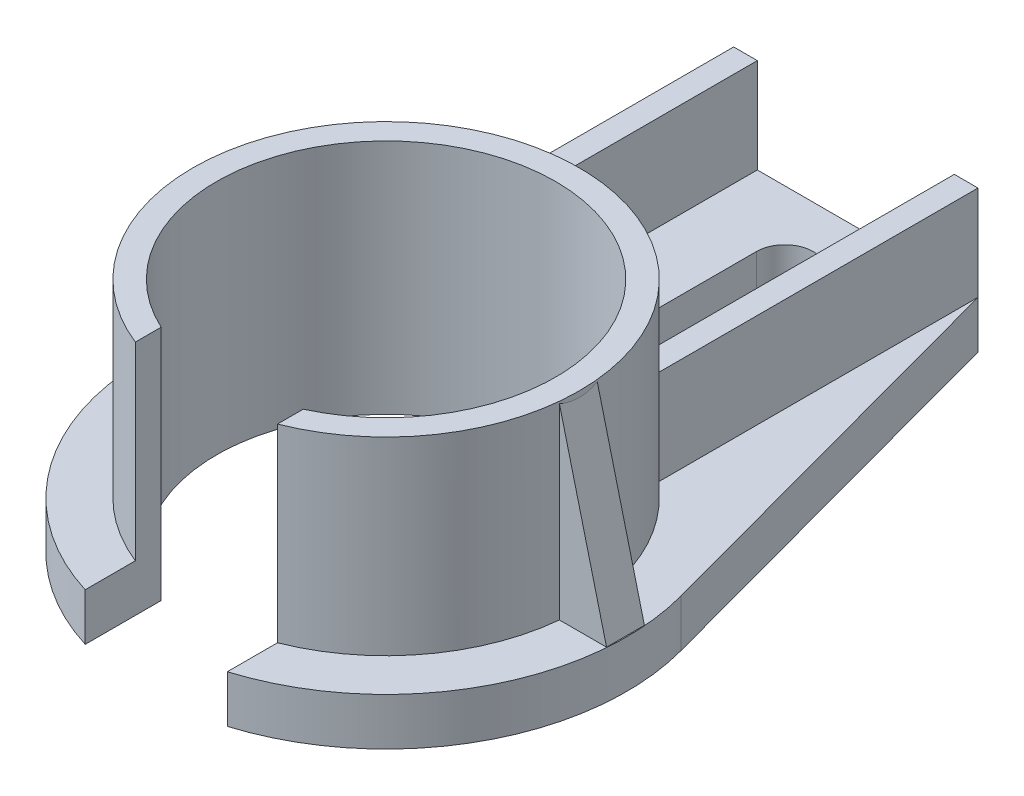
ISO-10303-21;
HEADER;
FILE_DESCRIPTION(('STEP AP214'),'2;1');
FILE_NAME('part.step','',(''),(''),'','','');
FILE_SCHEMA(('AUTOMOTIVE_DESIGN { 1 0 10303 214 1 1 1 1 }'));
ENDSEC;
DATA;
#1=APPLICATION_CONTEXT('core data for automotive mechanical design processes');
#2=APPLICATION_PROTOCOL_DEFINITION('international standard','automotive_design',2000,#1);
#3=PRODUCT_CONTEXT('',#1,'mechanical');
#4=PRODUCT('Part','Part','',(#3));
#5=PRODUCT_RELATED_PRODUCT_CATEGORY('part','',(#4));
#6=PRODUCT_DEFINITION_FORMATION('','',#4);
#7=PRODUCT_DEFINITION_CONTEXT('part definition',#1,'design');
#8=PRODUCT_DEFINITION('design','',#6,#7);
#9=PRODUCT_DEFINITION_SHAPE('','',#8);
#10=(LENGTH_UNIT() NAMED_UNIT(*) SI_UNIT(.MILLI.,.METRE.));
#11=(NAMED_UNIT(*) PLANE_ANGLE_UNIT() SI_UNIT($,.RADIAN.));
#12=(NAMED_UNIT(*) SI_UNIT($,.STERADIAN.) SOLID_ANGLE_UNIT());
#13=UNCERTAINTY_MEASURE_WITH_UNIT(LENGTH_MEASURE(1.E-05),#10,'distance_accuracy_value','');
#14=(GEOMETRIC_REPRESENTATION_CONTEXT(3) GLOBAL_UNCERTAINTY_ASSIGNED_CONTEXT((#13)) GLOBAL_UNIT_ASSIGNED_CONTEXT((#10,
#11,#12)) REPRESENTATION_CONTEXT('',''));
#15=CARTESIAN_POINT('',(0.,0.,0.));
#16=DIRECTION('',(0.,0.,1.));
#17=DIRECTION('',(1.,0.,0.));
#18=AXIS2_PLACEMENT_3D('',#15,#16,#17);
#19=CARTESIAN_POINT('',(0.,3.175,-16.129));
#20=DIRECTION('',(0.,1.,0.));
#21=DIRECTION('',(0.,0.,1.));
#22=AXIS2_PLACEMENT_3D('',#19,#20,#21);
#23=PLANE('',#22);
#24=CARTESIAN_POINT('',(0.,3.175,-16.129));
#25=DIRECTION('',(0.,1.,0.));
#26=DIRECTION('',(0.,0.,1.));
#27=AXIS2_PLACEMENT_3D('',#24,#25,#26);
#28=CIRCLE('',#27,16.129);
#29=CARTESIAN_POINT('',(-15.5698048629579,3.175,-20.3392039771743));
#30=VERTEX_POINT('',#29);
#31=CARTESIAN_POINT('',(-4.7625,3.175,-0.719157860964314));
#32=VERTEX_POINT('',#31);
#33=EDGE_CURVE('E262',#30,#32,#28,.T.);
#34=ORIENTED_EDGE('',*,*,#33,.T.);
#35=DIRECTION('',(0.,0.,-1.));
#36=VECTOR('',#35,1.);
#37=CARTESIAN_POINT('',(-4.7625,3.175,-16.129));
#38=LINE('',#37,#36);
#39=CARTESIAN_POINT('',(-4.7625,3.175,-4.08222824363306));
#40=VERTEX_POINT('',#39);
#41=EDGE_CURVE('E315',#32,#40,#38,.T.);
#42=ORIENTED_EDGE('',*,*,#41,.T.);
#43=CARTESIAN_POINT('',(0.,3.175,-16.129));
#44=DIRECTION('',(0.,1.,0.));
#45=DIRECTION('',(0.,0.,1.));
#46=AXIS2_PLACEMENT_3D('',#43,#44,#45);
#47=CIRCLE('',#46,12.954);
#48=CARTESIAN_POINT('',(-12.8915947810967,3.175,-14.859));
#49=VERTEX_POINT('',#48);
#50=EDGE_CURVE('E248',#49,#40,#47,.T.);
#51=ORIENTED_EDGE('',*,*,#50,.F.);
#52=DIRECTION('',(1.,0.,0.));
#53=VECTOR('',#52,1.);
#54=CARTESIAN_POINT('',(0.,3.175,-14.859));
#55=LINE('',#54,#53);
#56=CARTESIAN_POINT('',(-16.0506848685656,3.175,-14.859));
#57=VERTEX_POINT('',#56);
#58=EDGE_CURVE('E243',#57,#49,#55,.T.);
#59=ORIENTED_EDGE('',*,*,#58,.F.);
#60=DIRECTION('',(0.,0.,1.));
#61=VECTOR('',#60,1.);
#62=CARTESIAN_POINT('',(-16.0506848685656,3.175,-16.129));
#63=LINE('',#62,#61);
#64=CARTESIAN_POINT('',(-16.0506848685656,3.175,-17.399));
#65=VERTEX_POINT('',#64);
#66=EDGE_CURVE('E237',#65,#57,#63,.T.);
#67=ORIENTED_EDGE('',*,*,#66,.F.);
#68=DIRECTION('',(1.,0.,0.));
#69=VECTOR('',#68,1.);
#70=CARTESIAN_POINT('',(0.,3.175,-17.399));
#71=LINE('',#70,#69);
#72=CARTESIAN_POINT('',(-12.8915947810967,3.175,-17.399));
#73=VERTEX_POINT('',#72);
#74=EDGE_CURVE('E417',#65,#73,#71,.T.);
#75=ORIENTED_EDGE('',*,*,#74,.T.);
#76=CARTESIAN_POINT('',(-8.19149999999999,3.175,-26.1642101995923));
#77=VERTEX_POINT('',#76);
#78=EDGE_CURVE('E236',#77,#73,#47,.T.);
#79=ORIENTED_EDGE('',*,*,#78,.F.);
#80=DIRECTION('',(0.,0.,1.));
#81=VECTOR('',#80,1.);
#82=CARTESIAN_POINT('',(-8.19149999999999,3.175,-16.129));
#83=LINE('',#82,#81);
#84=CARTESIAN_POINT('',(-8.1915,3.175,-47.625));
#85=VERTEX_POINT('',#84);
#86=EDGE_CURVE('E359',#85,#77,#83,.T.);
#87=ORIENTED_EDGE('',*,*,#86,.F.);
#88=DIRECTION('',(-0.261033168651142,0.,0.965329832163051));
#89=VECTOR('',#88,1.);
#90=CARTESIAN_POINT('',(-8.1915,3.175,-47.625));
#91=LINE('',#90,#89);
#92=EDGE_CURVE('E259',#85,#30,#91,.T.);
#93=ORIENTED_EDGE('',*,*,#92,.T.);
#94=EDGE_LOOP('',(#34,#42,#51,#59,#67,#75,#79,#87,#93));
#95=FACE_BOUND('',#94,.T.);
#96=ADVANCED_FACE('F35',(#95),#23,.T.);
#97=CARTESIAN_POINT('',(4.7625,3.175,-4.08222824363306));
#98=VERTEX_POINT('',#97);
#99=CARTESIAN_POINT('',(12.8915947810967,3.175,-14.859));
#100=VERTEX_POINT('',#99);
#101=EDGE_CURVE('E251',#98,#100,#47,.T.);
#102=ORIENTED_EDGE('',*,*,#101,.F.);
#103=DIRECTION('',(0.,0.,1.));
#104=VECTOR('',#103,1.);
#105=CARTESIAN_POINT('',(4.7625,3.175,-16.129));
#106=LINE('',#105,#104);
#107=CARTESIAN_POINT('',(4.7625,3.175,-0.719157860964312));
#108=VERTEX_POINT('',#107);
#109=EDGE_CURVE('E57',#98,#108,#106,.T.);
#110=ORIENTED_EDGE('',*,*,#109,.T.);
#111=CARTESIAN_POINT('',(15.5698048629579,3.175,-20.3392039771743));
#112=VERTEX_POINT('',#111);
#113=EDGE_CURVE('E261',#108,#112,#28,.T.);
#114=ORIENTED_EDGE('',*,*,#113,.T.);
#115=DIRECTION('',(-0.261033168651142,0.,-0.965329832163051));
#116=VECTOR('',#115,1.);
#117=CARTESIAN_POINT('',(15.5698048629579,3.175,-20.3392039771743));
#118=LINE('',#117,#116);
#119=CARTESIAN_POINT('',(8.1915,3.175,-47.625));
#120=VERTEX_POINT('',#119);
#121=EDGE_CURVE('E254',#112,#120,#118,.T.);
#122=ORIENTED_EDGE('',*,*,#121,.T.);
#123=DIRECTION('',(0.,0.,-1.));
#124=VECTOR('',#123,1.);
#125=CARTESIAN_POINT('',(8.19149999999999,3.175,-16.129));
#126=LINE('',#125,#124);
#127=CARTESIAN_POINT('',(8.19149999999999,3.175,-26.1642101995923));
#128=VERTEX_POINT('',#127);
#129=EDGE_CURVE('E340',#128,#120,#126,.T.);
#130=ORIENTED_EDGE('',*,*,#129,.F.);
#131=CARTESIAN_POINT('',(12.8915947810967,3.175,-17.399));
#132=VERTEX_POINT('',#131);
#133=EDGE_CURVE('E241',#132,#128,#47,.T.);
#134=ORIENTED_EDGE('',*,*,#133,.F.);
#135=DIRECTION('',(1.,0.,0.));
#136=VECTOR('',#135,1.);
#137=CARTESIAN_POINT('',(0.,3.175,-17.399));
#138=LINE('',#137,#136);
#139=CARTESIAN_POINT('',(16.0506848685656,3.175,-17.399));
#140=VERTEX_POINT('',#139);
#141=EDGE_CURVE('E401',#132,#140,#138,.T.);
#142=ORIENTED_EDGE('',*,*,#141,.T.);
#143=DIRECTION('',(0.,0.,1.));
#144=VECTOR('',#143,1.);
#145=CARTESIAN_POINT('',(16.0506848685656,3.175,-16.129));
#146=LINE('',#145,#144);
#147=CARTESIAN_POINT('',(16.0506848685656,3.175,-14.859));
#148=VERTEX_POINT('',#147);
#149=EDGE_CURVE('E409',#148,#140,#146,.F.);
#150=ORIENTED_EDGE('',*,*,#149,.F.);
#151=DIRECTION('',(1.,0.,0.));
#152=VECTOR('',#151,1.);
#153=CARTESIAN_POINT('',(0.,3.175,-14.859));
#154=LINE('',#153,#152);
#155=EDGE_CURVE('E406',#100,#148,#154,.T.);
#156=ORIENTED_EDGE('',*,*,#155,.F.);
#157=EDGE_LOOP('',(#102,#110,#114,#122,#130,#134,#142,#150,#156));
#158=FACE_BOUND('',#157,.T.);
#159=ADVANCED_FACE('F471',(#158),#23,.T.);
#160=CARTESIAN_POINT('',(0.,0.,-16.129));
#161=DIRECTION('',(0.,1.,0.));
#162=DIRECTION('',(0.,0.,1.));
#163=AXIS2_PLACEMENT_3D('',#160,#161,#162);
#164=PLANE('',#163);
#165=DIRECTION('',(0.,0.,-1.));
#166=VECTOR('',#165,1.);
#167=CARTESIAN_POINT('',(1.89865,0.,-42.8625));
#168=LINE('',#167,#166);
#169=CARTESIAN_POINT('',(1.89865,0.,-35.433));
#170=VERTEX_POINT('',#169);
#171=CARTESIAN_POINT('',(1.89865,0.,-42.8625));
#172=VERTEX_POINT('',#171);
#173=EDGE_CURVE('E373',#170,#172,#168,.T.);
#174=ORIENTED_EDGE('',*,*,#173,.T.);
#175=CARTESIAN_POINT('',(0.,0.,-42.8625));
#176=DIRECTION('',(0.,1.,0.));
#177=DIRECTION('',(0.,0.,1.));
#178=AXIS2_PLACEMENT_3D('',#175,#176,#177);
#179=CIRCLE('',#178,1.89865);
#180=CARTESIAN_POINT('',(-1.89865,0.,-42.8625));
#181=VERTEX_POINT('',#180);
#182=EDGE_CURVE('E363',#172,#181,#179,.T.);
#183=ORIENTED_EDGE('',*,*,#182,.T.);
#184=DIRECTION('',(0.,0.,1.));
#185=VECTOR('',#184,1.);
#186=CARTESIAN_POINT('',(-1.89865,0.,-42.8625));
#187=LINE('',#186,#185);
#188=CARTESIAN_POINT('',(-1.89865,0.,-35.433));
#189=VERTEX_POINT('',#188);
#190=EDGE_CURVE('E366',#181,#189,#187,.T.);
#191=ORIENTED_EDGE('',*,*,#190,.T.);
#192=CARTESIAN_POINT('',(0.,0.,-35.433));
#193=DIRECTION('',(0.,1.,0.));
#194=DIRECTION('',(0.,0.,1.));
#195=AXIS2_PLACEMENT_3D('',#192,#193,#194);
#196=CIRCLE('',#195,1.89865);
#197=EDGE_CURVE('E370',#189,#170,#196,.T.);
#198=ORIENTED_EDGE('',*,*,#197,.T.);
#199=EDGE_LOOP('',(#174,#183,#191,#198));
#200=FACE_BOUND('',#199,.T.);
#201=DIRECTION('',(0.,0.,1.));
#202=VECTOR('',#201,1.);
#203=CARTESIAN_POINT('',(-4.7625,0.,7.79419313874928));
#204=LINE('',#203,#202);
#205=CARTESIAN_POINT('',(-4.7625,0.,-5.80834517581369));
#206=VERTEX_POINT('',#205);
#207=CARTESIAN_POINT('',(-4.7625,0.,-0.719157860964314));
#208=VERTEX_POINT('',#207);
#209=EDGE_CURVE('E214',#206,#208,#204,.T.);
#210=ORIENTED_EDGE('',*,*,#209,.T.);
#211=CARTESIAN_POINT('',(0.,0.,-16.129));
#212=DIRECTION('',(0.,1.,0.));
#213=DIRECTION('',(0.,0.,1.));
#214=AXIS2_PLACEMENT_3D('',#211,#212,#213);
#215=CIRCLE('',#214,16.129);
#216=CARTESIAN_POINT('',(-15.5698048629579,0.,-20.3392039771743));
#217=VERTEX_POINT('',#216);
#218=EDGE_CURVE('E257',#217,#208,#215,.T.);
#219=ORIENTED_EDGE('',*,*,#218,.F.);
#220=DIRECTION('',(-0.261033168651142,0.,0.965329832163051));
#221=VECTOR('',#220,1.);
#222=CARTESIAN_POINT('',(-8.1915,0.,-47.625));
#223=LINE('',#222,#221);
#224=CARTESIAN_POINT('',(-8.1915,0.,-47.625));
#225=VERTEX_POINT('',#224);
#226=EDGE_CURVE('E270',#225,#217,#223,.T.);
#227=ORIENTED_EDGE('',*,*,#226,.F.);
#228=DIRECTION('',(-1.,0.,0.));
#229=VECTOR('',#228,1.);
#230=CARTESIAN_POINT('',(-8.1915,0.,-47.625));
#231=LINE('',#230,#229);
#232=CARTESIAN_POINT('',(8.1915,0.,-47.625));
#233=VERTEX_POINT('',#232);
#234=EDGE_CURVE('E268',#233,#225,#231,.T.);
#235=ORIENTED_EDGE('',*,*,#234,.F.);
#236=DIRECTION('',(-0.261033168651142,0.,-0.965329832163051));
#237=VECTOR('',#236,1.);
#238=CARTESIAN_POINT('',(15.5698048629579,0.,-20.3392039771743));
#239=LINE('',#238,#237);
#240=CARTESIAN_POINT('',(15.5698048629579,0.,-20.3392039771743));
#241=VERTEX_POINT('',#240);
#242=EDGE_CURVE('E253',#241,#233,#239,.T.);
#243=ORIENTED_EDGE('',*,*,#242,.F.);
#244=CARTESIAN_POINT('',(4.7625,0.,-0.719157860964312));
#245=VERTEX_POINT('',#244);
#246=EDGE_CURVE('E272',#245,#241,#215,.T.);
#247=ORIENTED_EDGE('',*,*,#246,.F.);
#248=DIRECTION('',(0.,0.,-1.));
#249=VECTOR('',#248,1.);
#250=CARTESIAN_POINT('',(4.7625,0.,7.79419313874928));
#251=LINE('',#250,#249);
#252=CARTESIAN_POINT('',(4.7625,0.,-5.80834517581369));
#253=VERTEX_POINT('',#252);
#254=EDGE_CURVE('E231',#245,#253,#251,.T.);
#255=ORIENTED_EDGE('',*,*,#254,.T.);
#256=CARTESIAN_POINT('',(0.,0.,-16.129));
#257=DIRECTION('',(0.,1.,0.));
#258=DIRECTION('',(0.,0.,1.));
#259=AXIS2_PLACEMENT_3D('',#256,#257,#258);
#260=CIRCLE('',#259,11.3665);
#261=EDGE_CURVE('E247',#253,#206,#260,.T.);
#262=ORIENTED_EDGE('',*,*,#261,.T.);
#263=EDGE_LOOP('',(#210,#219,#227,#235,#243,#247,#255,#262));
#264=FACE_BOUND('',#263,.T.);
#265=ADVANCED_FACE('F490',(#200,#264),#164,.F.);
#266=CARTESIAN_POINT('',(0.,3.175,-16.129));
#267=DIRECTION('',(0.,-1.,0.));
#268=DIRECTION('',(0.,0.,-1.));
#269=AXIS2_PLACEMENT_3D('',#266,#267,#268);
#270=CYLINDRICAL_SURFACE('',#269,16.129);
#271=DIRECTION('',(0.,-1.,0.));
#272=VECTOR('',#271,1.);
#273=CARTESIAN_POINT('',(-4.7625,3.175,-0.719157860964314));
#274=LINE('',#273,#272);
#275=EDGE_CURVE('E220',#32,#208,#274,.T.);
#276=ORIENTED_EDGE('',*,*,#275,.F.);
#277=ORIENTED_EDGE('',*,*,#33,.F.);
#278=DIRECTION('',(0.,-1.,0.));
#279=VECTOR('',#278,1.);
#280=CARTESIAN_POINT('',(-15.5698048629579,3.175,-20.3392039771743));
#281=LINE('',#280,#279);
#282=EDGE_CURVE('E277',#30,#217,#281,.T.);
#283=ORIENTED_EDGE('',*,*,#282,.T.);
#284=ORIENTED_EDGE('',*,*,#218,.T.);
#285=EDGE_LOOP('',(#276,#277,#283,#284));
#286=FACE_BOUND('',#285,.T.);
#287=ADVANCED_FACE('F494',(#286),#270,.T.);
#288=DIRECTION('',(0.,-1.,0.));
#289=VECTOR('',#288,1.);
#290=CARTESIAN_POINT('',(4.7625,3.175,-0.719157860964312));
#291=LINE('',#290,#289);
#292=EDGE_CURVE('E322',#245,#108,#291,.F.);
#293=ORIENTED_EDGE('',*,*,#292,.F.);
#294=ORIENTED_EDGE('',*,*,#246,.T.);
#295=DIRECTION('',(0.,-1.,0.));
#296=VECTOR('',#295,1.);
#297=CARTESIAN_POINT('',(15.5698048629579,3.175,-20.3392039771743));
#298=LINE('',#297,#296);
#299=EDGE_CURVE('E265',#112,#241,#298,.T.);
#300=ORIENTED_EDGE('',*,*,#299,.F.);
#301=ORIENTED_EDGE('',*,*,#113,.F.);
#302=EDGE_LOOP('',(#293,#294,#300,#301));
#303=FACE_BOUND('',#302,.T.);
#304=ADVANCED_FACE('F499',(#303),#270,.T.);
#305=CARTESIAN_POINT('',(0.,3.175,-16.129));
#306=DIRECTION('',(0.,-1.,0.));
#307=DIRECTION('',(0.,0.,-1.));
#308=AXIS2_PLACEMENT_3D('',#305,#306,#307);
#309=CYLINDRICAL_SURFACE('',#308,11.3665);
#310=CARTESIAN_POINT('',(0.,15.875,-16.129));
#311=DIRECTION('',(0.,1.,0.));
#312=DIRECTION('',(0.,0.,1.));
#313=AXIS2_PLACEMENT_3D('',#310,#311,#312);
#314=CIRCLE('',#313,11.3665);
#315=CARTESIAN_POINT('',(4.7625,15.875,-5.80834517581369));
#316=VERTEX_POINT('',#315);
#317=CARTESIAN_POINT('',(-4.7625,15.875,-5.80834517581369));
#318=VERTEX_POINT('',#317);
#319=EDGE_CURVE('E227',#316,#318,#314,.T.);
#320=ORIENTED_EDGE('',*,*,#319,.T.);
#321=DIRECTION('',(0.,-1.,0.));
#322=VECTOR('',#321,1.);
#323=CARTESIAN_POINT('',(-4.7625,3.175,-5.80834517581369));
#324=LINE('',#323,#322);
#325=EDGE_CURVE('E211',#318,#206,#324,.T.);
#326=ORIENTED_EDGE('',*,*,#325,.T.);
#327=ORIENTED_EDGE('',*,*,#261,.F.);
#328=DIRECTION('',(0.,-1.,0.));
#329=VECTOR('',#328,1.);
#330=CARTESIAN_POINT('',(4.7625,3.175,-5.80834517581369));
#331=LINE('',#330,#329);
#332=EDGE_CURVE('E235',#253,#316,#331,.F.);
#333=ORIENTED_EDGE('',*,*,#332,.T.);
#334=EDGE_LOOP('',(#320,#326,#327,#333));
#335=FACE_BOUND('',#334,.T.);
#336=ADVANCED_FACE('F234',(#335),#309,.F.);
#337=CARTESIAN_POINT('',(0.,15.875,-16.129));
#338=DIRECTION('',(0.,1.,0.));
#339=DIRECTION('',(0.,0.,1.));
#340=AXIS2_PLACEMENT_3D('',#337,#338,#339);
#341=PLANE('',#340);
#342=CARTESIAN_POINT('',(0.,15.875,-16.129));
#343=DIRECTION('',(0.,1.,0.));
#344=DIRECTION('',(0.,0.,1.));
#345=AXIS2_PLACEMENT_3D('',#342,#343,#344);
#346=CIRCLE('',#345,12.954);
#347=CARTESIAN_POINT('',(4.7625,15.875,-4.08222824363305));
#348=VERTEX_POINT('',#347);
#349=CARTESIAN_POINT('',(-4.7625,15.875,-4.08222824363306));
#350=VERTEX_POINT('',#349);
#351=EDGE_CURVE('E229',#348,#350,#346,.T.);
#352=ORIENTED_EDGE('',*,*,#351,.T.);
#353=DIRECTION('',(0.,0.,1.));
#354=VECTOR('',#353,1.);
#355=CARTESIAN_POINT('',(-4.7625,15.875,7.79419313874928));
#356=LINE('',#355,#354);
#357=EDGE_CURVE('E49',#318,#350,#356,.T.);
#358=ORIENTED_EDGE('',*,*,#357,.F.);
#359=ORIENTED_EDGE('',*,*,#319,.F.);
#360=DIRECTION('',(0.,0.,-1.));
#361=VECTOR('',#360,1.);
#362=CARTESIAN_POINT('',(4.7625,15.875,7.79419313874928));
#363=LINE('',#362,#361);
#364=EDGE_CURVE('E230',#348,#316,#363,.T.);
#365=ORIENTED_EDGE('',*,*,#364,.F.);
#366=EDGE_LOOP('',(#352,#358,#359,#365));
#367=FACE_BOUND('',#366,.T.);
#368=ADVANCED_FACE('F225',(#367),#341,.T.);
#369=CARTESIAN_POINT('',(0.,15.875,-16.129));
#370=DIRECTION('',(0.,-1.,0.));
#371=DIRECTION('',(0.,0.,-1.));
#372=AXIS2_PLACEMENT_3D('',#369,#370,#371);
#373=CYLINDRICAL_SURFACE('',#372,12.954);
#374=DIRECTION('',(0.,-1.,0.));
#375=VECTOR('',#374,1.);
#376=CARTESIAN_POINT('',(-4.7625,15.875,-4.08222824363306));
#377=LINE('',#376,#375);
#378=EDGE_CURVE('E11',#350,#40,#377,.T.);
#379=ORIENTED_EDGE('',*,*,#378,.F.);
#380=ORIENTED_EDGE('',*,*,#351,.F.);
#381=DIRECTION('',(0.,-1.,0.));
#382=VECTOR('',#381,1.);
#383=CARTESIAN_POINT('',(4.7625,15.875,-4.08222824363305));
#384=LINE('',#383,#382);
#385=EDGE_CURVE('E43',#98,#348,#384,.F.);
#386=ORIENTED_EDGE('',*,*,#385,.F.);
#387=ORIENTED_EDGE('',*,*,#101,.T.);
#388=DIRECTION('',(0.,-1.,0.));
#389=VECTOR('',#388,1.);
#390=CARTESIAN_POINT('',(12.8915947810967,15.875,-14.859));
#391=LINE('',#390,#389);
#392=CARTESIAN_POINT('',(12.8915947810967,15.7349085217891,-14.859));
#393=VERTEX_POINT('',#392);
#394=EDGE_CURVE('E403',#100,#393,#391,.F.);
#395=ORIENTED_EDGE('',*,*,#394,.T.);
#396=CARTESIAN_POINT('',(0.,66.989303511291,-16.129));
#397=DIRECTION('',(-0.969794263970818,-0.243924343945617,0.));
#398=DIRECTION('',(0.243924343945617,-0.969794263970818,0.));
#399=AXIS2_PLACEMENT_3D('',#396,#397,#398);
#400=ELLIPSE('',#399,53.1066304841149,12.954);
#401=CARTESIAN_POINT('',(12.8915947810967,15.7349085217891,-17.399));
#402=VERTEX_POINT('',#401);
#403=EDGE_CURVE('E293',#393,#402,#400,.F.);
#404=ORIENTED_EDGE('',*,*,#403,.T.);
#405=DIRECTION('',(0.,-1.,0.));
#406=VECTOR('',#405,1.);
#407=CARTESIAN_POINT('',(12.8915947810967,15.875,-17.399));
#408=LINE('',#407,#406);
#409=EDGE_CURVE('E398',#132,#402,#408,.F.);
#410=ORIENTED_EDGE('',*,*,#409,.F.);
#411=ORIENTED_EDGE('',*,*,#133,.T.);
#412=DIRECTION('',(0.,-1.,0.));
#413=VECTOR('',#412,1.);
#414=CARTESIAN_POINT('',(8.1915,15.875,-26.1642101995923));
#415=LINE('',#414,#413);
#416=CARTESIAN_POINT('',(8.1915,9.525,-26.1642101995923));
#417=VERTEX_POINT('',#416);
#418=EDGE_CURVE('E307',#128,#417,#415,.F.);
#419=ORIENTED_EDGE('',*,*,#418,.T.);
#420=CARTESIAN_POINT('',(0.,9.525,-16.129));
#421=DIRECTION('',(0.,1.,0.));
#422=DIRECTION('',(0.,0.,1.));
#423=AXIS2_PLACEMENT_3D('',#420,#421,#422);
#424=CIRCLE('',#423,12.954);
#425=CARTESIAN_POINT('',(6.604,9.525,-27.273204771988));
#426=VERTEX_POINT('',#425);
#427=EDGE_CURVE('E305',#417,#426,#424,.T.);
#428=ORIENTED_EDGE('',*,*,#427,.T.);
#429=DIRECTION('',(0.,-1.,0.));
#430=VECTOR('',#429,1.);
#431=CARTESIAN_POINT('',(6.604,15.875,-27.273204771988));
#432=LINE('',#431,#430);
#433=CARTESIAN_POINT('',(6.604,3.175,-27.273204771988));
#434=VERTEX_POINT('',#433);
#435=EDGE_CURVE('E302',#434,#426,#432,.F.);
#436=ORIENTED_EDGE('',*,*,#435,.F.);
#437=CARTESIAN_POINT('',(-6.604,3.175,-27.273204771988));
#438=VERTEX_POINT('',#437);
#439=EDGE_CURVE('E239',#434,#438,#47,.T.);
#440=ORIENTED_EDGE('',*,*,#439,.T.);
#441=DIRECTION('',(0.,-1.,0.));
#442=VECTOR('',#441,1.);
#443=CARTESIAN_POINT('',(-6.604,15.875,-27.273204771988));
#444=LINE('',#443,#442);
#445=CARTESIAN_POINT('',(-6.604,9.525,-27.273204771988));
#446=VERTEX_POINT('',#445);
#447=EDGE_CURVE('E295',#446,#438,#444,.T.);
#448=ORIENTED_EDGE('',*,*,#447,.F.);
#449=CARTESIAN_POINT('',(0.,9.525,-16.129));
#450=DIRECTION('',(0.,-1.,0.));
#451=DIRECTION('',(0.,0.,-1.));
#452=AXIS2_PLACEMENT_3D('',#449,#450,#451);
#453=CIRCLE('',#452,12.954);
#454=CARTESIAN_POINT('',(-8.1915,9.525,-26.1642101995923));
#455=VERTEX_POINT('',#454);
#456=EDGE_CURVE('E296',#446,#455,#453,.F.);
#457=ORIENTED_EDGE('',*,*,#456,.T.);
#458=DIRECTION('',(0.,-1.,0.));
#459=VECTOR('',#458,1.);
#460=CARTESIAN_POINT('',(-8.1915,15.875,-26.1642101995923));
#461=LINE('',#460,#459);
#462=EDGE_CURVE('E298',#455,#77,#461,.T.);
#463=ORIENTED_EDGE('',*,*,#462,.T.);
#464=ORIENTED_EDGE('',*,*,#78,.T.);
#465=DIRECTION('',(0.,-1.,0.));
#466=VECTOR('',#465,1.);
#467=CARTESIAN_POINT('',(-12.8915947810967,15.875,-17.399));
#468=LINE('',#467,#466);
#469=CARTESIAN_POINT('',(-12.8915947810967,15.7349085217891,-17.399));
#470=VERTEX_POINT('',#469);
#471=EDGE_CURVE('E286',#470,#73,#468,.T.);
#472=ORIENTED_EDGE('',*,*,#471,.F.);
#473=CARTESIAN_POINT('',(0.,66.989303511291,-16.129));
#474=DIRECTION('',(-0.969794263970818,0.243924343945617,0.));
#475=DIRECTION('',(-0.243924343945617,-0.969794263970818,0.));
#476=AXIS2_PLACEMENT_3D('',#473,#474,#475);
#477=ELLIPSE('',#476,53.1066304841149,12.954);
#478=CARTESIAN_POINT('',(-12.8915947810967,15.7349085217891,-14.859));
#479=VERTEX_POINT('',#478);
#480=EDGE_CURVE('E289',#470,#479,#477,.T.);
#481=ORIENTED_EDGE('',*,*,#480,.T.);
#482=DIRECTION('',(0.,-1.,0.));
#483=VECTOR('',#482,1.);
#484=CARTESIAN_POINT('',(-12.8915947810967,15.875,-14.859));
#485=LINE('',#484,#483);
#486=EDGE_CURVE('E291',#479,#49,#485,.T.);
#487=ORIENTED_EDGE('',*,*,#486,.T.);
#488=ORIENTED_EDGE('',*,*,#50,.T.);
#489=EDGE_LOOP('',(#379,#380,#386,#387,#395,#404,#410,#411,#419,#428,#436,#440,#448,#457,#463,
#464,#472,#481,#487,#488));
#490=FACE_BOUND('',#489,.T.);
#491=ADVANCED_FACE('F312',(#490),#373,.T.);
#492=CARTESIAN_POINT('',(0.,3.175,-42.8625));
#493=DIRECTION('',(0.,1.,0.));
#494=DIRECTION('',(0.,0.,1.));
#495=AXIS2_PLACEMENT_3D('',#492,#493,#494);
#496=CIRCLE('',#495,1.89865);
#497=CARTESIAN_POINT('',(1.89865,3.175,-42.8625));
#498=VERTEX_POINT('',#497);
#499=CARTESIAN_POINT('',(-1.89865,3.175,-42.8625));
#500=VERTEX_POINT('',#499);
#501=EDGE_CURVE('E362',#498,#500,#496,.T.);
#502=ORIENTED_EDGE('',*,*,#501,.F.);
#503=DIRECTION('',(0.,0.,-1.));
#504=VECTOR('',#503,1.);
#505=CARTESIAN_POINT('',(1.89865,3.175,-42.8625));
#506=LINE('',#505,#504);
#507=CARTESIAN_POINT('',(1.89865,3.175,-35.433));
#508=VERTEX_POINT('',#507);
#509=EDGE_CURVE('E367',#508,#498,#506,.T.);
#510=ORIENTED_EDGE('',*,*,#509,.F.);
#511=CARTESIAN_POINT('',(0.,3.175,-35.433));
#512=DIRECTION('',(0.,1.,0.));
#513=DIRECTION('',(0.,0.,1.));
#514=AXIS2_PLACEMENT_3D('',#511,#512,#513);
#515=CIRCLE('',#514,1.89865);
#516=CARTESIAN_POINT('',(-1.89865,3.175,-35.433));
#517=VERTEX_POINT('',#516);
#518=EDGE_CURVE('E381',#517,#508,#515,.T.);
#519=ORIENTED_EDGE('',*,*,#518,.F.);
#520=DIRECTION('',(0.,0.,1.));
#521=VECTOR('',#520,1.);
#522=CARTESIAN_POINT('',(-1.89865,3.175,-42.8625));
#523=LINE('',#522,#521);
#524=EDGE_CURVE('E378',#500,#517,#523,.T.);
#525=ORIENTED_EDGE('',*,*,#524,.F.);
#526=EDGE_LOOP('',(#502,#510,#519,#525));
#527=FACE_BOUND('',#526,.T.);
#528=ORIENTED_EDGE('',*,*,#439,.F.);
#529=DIRECTION('',(0.,0.,-1.));
#530=VECTOR('',#529,1.);
#531=CARTESIAN_POINT('',(6.60399999999999,3.175,-16.129));
#532=LINE('',#531,#530);
#533=CARTESIAN_POINT('',(6.604,3.175,-47.625));
#534=VERTEX_POINT('',#533);
#535=EDGE_CURVE('E338',#434,#534,#532,.T.);
#536=ORIENTED_EDGE('',*,*,#535,.T.);
#537=DIRECTION('',(-1.,0.,0.));
#538=VECTOR('',#537,1.);
#539=CARTESIAN_POINT('',(-8.1915,3.175,-47.625));
#540=LINE('',#539,#538);
#541=CARTESIAN_POINT('',(-6.604,3.175,-47.625));
#542=VERTEX_POINT('',#541);
#543=EDGE_CURVE('E256',#534,#542,#540,.T.);
#544=ORIENTED_EDGE('',*,*,#543,.T.);
#545=DIRECTION('',(0.,0.,1.));
#546=VECTOR('',#545,1.);
#547=CARTESIAN_POINT('',(-6.60399999999999,3.175,-16.129));
#548=LINE('',#547,#546);
#549=EDGE_CURVE('E356',#542,#438,#548,.T.);
#550=ORIENTED_EDGE('',*,*,#549,.T.);
#551=EDGE_LOOP('',(#528,#536,#544,#550));
#552=FACE_BOUND('',#551,.T.);
#553=ADVANCED_FACE('F475',(#527,#552),#23,.T.);
#554=CARTESIAN_POINT('',(15.5698048629579,3.175,-20.3392039771743));
#555=DIRECTION('',(-0.965329832163051,0.,0.261033168651142));
#556=DIRECTION('',(0.261033168651142,0.,0.965329832163051));
#557=AXIS2_PLACEMENT_3D('',#554,#555,#556);
#558=PLANE('',#557);
#559=ORIENTED_EDGE('',*,*,#242,.T.);
#560=DIRECTION('',(0.,-1.,0.));
#561=VECTOR('',#560,1.);
#562=CARTESIAN_POINT('',(8.1915,3.175,-47.625));
#563=LINE('',#562,#561);
#564=EDGE_CURVE('E283',#120,#233,#563,.T.);
#565=ORIENTED_EDGE('',*,*,#564,.F.);
#566=ORIENTED_EDGE('',*,*,#121,.F.);
#567=ORIENTED_EDGE('',*,*,#299,.T.);
#568=EDGE_LOOP('',(#559,#565,#566,#567));
#569=FACE_BOUND('',#568,.T.);
#570=ADVANCED_FACE('F37',(#569),#558,.F.);
#571=CARTESIAN_POINT('',(-8.1915,3.175,-47.625));
#572=DIRECTION('',(0.,0.,1.));
#573=DIRECTION('',(1.,0.,0.));
#574=AXIS2_PLACEMENT_3D('',#571,#572,#573);
#575=PLANE('',#574);
#576=ORIENTED_EDGE('',*,*,#234,.T.);
#577=DIRECTION('',(0.,-1.,0.));
#578=VECTOR('',#577,1.);
#579=CARTESIAN_POINT('',(-8.1915,3.175,-47.625));
#580=LINE('',#579,#578);
#581=EDGE_CURVE('E280',#85,#225,#580,.T.);
#582=ORIENTED_EDGE('',*,*,#581,.F.);
#583=DIRECTION('',(0.,1.,0.));
#584=VECTOR('',#583,1.);
#585=CARTESIAN_POINT('',(-8.1915,9.525,-47.625));
#586=LINE('',#585,#584);
#587=CARTESIAN_POINT('',(-8.1915,9.525,-47.625));
#588=VERTEX_POINT('',#587);
#589=EDGE_CURVE('E344',#85,#588,#586,.T.);
#590=ORIENTED_EDGE('',*,*,#589,.T.);
#591=DIRECTION('',(-1.,0.,0.));
#592=VECTOR('',#591,1.);
#593=CARTESIAN_POINT('',(-8.1915,9.525,-47.625));
#594=LINE('',#593,#592);
#595=CARTESIAN_POINT('',(-6.604,9.525,-47.625));
#596=VERTEX_POINT('',#595);
#597=EDGE_CURVE('E350',#596,#588,#594,.T.);
#598=ORIENTED_EDGE('',*,*,#597,.F.);
#599=DIRECTION('',(0.,1.,0.));
#600=VECTOR('',#599,1.);
#601=CARTESIAN_POINT('',(-6.604,7.9375,-47.625));
#602=LINE('',#601,#600);
#603=EDGE_CURVE('E343',#542,#596,#602,.T.);
#604=ORIENTED_EDGE('',*,*,#603,.F.);
#605=ORIENTED_EDGE('',*,*,#543,.F.);
#606=DIRECTION('',(0.,1.,0.));
#607=VECTOR('',#606,1.);
#608=CARTESIAN_POINT('',(6.604,7.9375,-47.625));
#609=LINE('',#608,#607);
#610=CARTESIAN_POINT('',(6.604,9.525,-47.625));
#611=VERTEX_POINT('',#610);
#612=EDGE_CURVE('E219',#534,#611,#609,.T.);
#613=ORIENTED_EDGE('',*,*,#612,.T.);
#614=DIRECTION('',(1.,0.,0.));
#615=VECTOR('',#614,1.);
#616=CARTESIAN_POINT('',(8.1915,9.525,-47.625));
#617=LINE('',#616,#615);
#618=CARTESIAN_POINT('',(8.1915,9.525,-47.625));
#619=VERTEX_POINT('',#618);
#620=EDGE_CURVE('E332',#611,#619,#617,.T.);
#621=ORIENTED_EDGE('',*,*,#620,.T.);
#622=DIRECTION('',(0.,1.,0.));
#623=VECTOR('',#622,1.);
#624=CARTESIAN_POINT('',(8.1915,9.525,-47.625));
#625=LINE('',#624,#623);
#626=EDGE_CURVE('E326',#120,#619,#625,.T.);
#627=ORIENTED_EDGE('',*,*,#626,.F.);
#628=ORIENTED_EDGE('',*,*,#564,.T.);
#629=EDGE_LOOP('',(#576,#582,#590,#598,#604,#605,#613,#621,#627,#628));
#630=FACE_BOUND('',#629,.T.);
#631=ADVANCED_FACE('F441',(#630),#575,.F.);
#632=CARTESIAN_POINT('',(-8.1915,3.175,-47.625));
#633=DIRECTION('',(0.965329832163051,0.,0.261033168651142));
#634=DIRECTION('',(0.261033168651142,0.,-0.965329832163051));
#635=AXIS2_PLACEMENT_3D('',#632,#633,#634);
#636=PLANE('',#635);
#637=ORIENTED_EDGE('',*,*,#226,.T.);
#638=ORIENTED_EDGE('',*,*,#282,.F.);
#639=ORIENTED_EDGE('',*,*,#92,.F.);
#640=ORIENTED_EDGE('',*,*,#581,.T.);
#641=EDGE_LOOP('',(#637,#638,#639,#640));
#642=FACE_BOUND('',#641,.T.);
#643=ADVANCED_FACE('F504',(#642),#636,.F.);
#644=CARTESIAN_POINT('',(-12.8563587282714,15.875,-16.129));
#645=DIRECTION('',(-0.969794263970818,0.243924343945617,0.));
#646=DIRECTION('',(-0.243924343945617,-0.969794263970818,0.));
#647=AXIS2_PLACEMENT_3D('',#644,#645,#646);
#648=PLANE('',#647);
#649=DIRECTION('',(-0.243924343945617,-0.969794263970818,0.));
#650=VECTOR('',#649,1.);
#651=CARTESIAN_POINT('',(-12.8563587282714,15.875,-17.399));
#652=LINE('',#651,#650);
#653=EDGE_CURVE('E413',#470,#65,#652,.T.);
#654=ORIENTED_EDGE('',*,*,#653,.T.);
#655=ORIENTED_EDGE('',*,*,#66,.T.);
#656=DIRECTION('',(-0.243924343945617,-0.969794263970818,0.));
#657=VECTOR('',#656,1.);
#658=CARTESIAN_POINT('',(-12.8563587282714,15.875,-14.859));
#659=LINE('',#658,#657);
#660=EDGE_CURVE('E414',#479,#57,#659,.T.);
#661=ORIENTED_EDGE('',*,*,#660,.F.);
#662=ORIENTED_EDGE('',*,*,#480,.F.);
#663=EDGE_LOOP('',(#654,#655,#661,#662));
#664=FACE_BOUND('',#663,.T.);
#665=ADVANCED_FACE('F427',(#664),#648,.T.);
#666=CARTESIAN_POINT('',(0.,7.9375,-14.859));
#667=DIRECTION('',(0.,0.,1.));
#668=DIRECTION('',(1.,0.,0.));
#669=AXIS2_PLACEMENT_3D('',#666,#667,#668);
#670=PLANE('',#669);
#671=ORIENTED_EDGE('',*,*,#58,.T.);
#672=ORIENTED_EDGE('',*,*,#486,.F.);
#673=ORIENTED_EDGE('',*,*,#660,.T.);
#674=EDGE_LOOP('',(#671,#672,#673));
#675=FACE_BOUND('',#674,.T.);
#676=ADVANCED_FACE('F423',(#675),#670,.T.);
#677=CARTESIAN_POINT('',(0.,7.9375,-17.399));
#678=DIRECTION('',(0.,0.,1.));
#679=DIRECTION('',(1.,0.,0.));
#680=AXIS2_PLACEMENT_3D('',#677,#678,#679);
#681=PLANE('',#680);
#682=ORIENTED_EDGE('',*,*,#74,.F.);
#683=ORIENTED_EDGE('',*,*,#653,.F.);
#684=ORIENTED_EDGE('',*,*,#471,.T.);
#685=EDGE_LOOP('',(#682,#683,#684));
#686=FACE_BOUND('',#685,.T.);
#687=ADVANCED_FACE('F431',(#686),#681,.F.);
#688=CARTESIAN_POINT('',(12.8563587282714,15.875,-16.129));
#689=DIRECTION('',(-0.969794263970818,-0.243924343945617,0.));
#690=DIRECTION('',(0.243924343945617,-0.969794263970818,0.));
#691=AXIS2_PLACEMENT_3D('',#688,#689,#690);
#692=PLANE('',#691);
#693=DIRECTION('',(0.243924343945617,-0.969794263970818,0.));
#694=VECTOR('',#693,1.);
#695=CARTESIAN_POINT('',(12.8563587282714,15.875,-14.859));
#696=LINE('',#695,#694);
#697=EDGE_CURVE('E395',#393,#148,#696,.T.);
#698=ORIENTED_EDGE('',*,*,#697,.T.);
#699=ORIENTED_EDGE('',*,*,#149,.T.);
#700=DIRECTION('',(0.243924343945617,-0.969794263970818,0.));
#701=VECTOR('',#700,1.);
#702=CARTESIAN_POINT('',(12.8563587282714,15.875,-17.399));
#703=LINE('',#702,#701);
#704=EDGE_CURVE('E388',#402,#140,#703,.T.);
#705=ORIENTED_EDGE('',*,*,#704,.F.);
#706=ORIENTED_EDGE('',*,*,#403,.F.);
#707=EDGE_LOOP('',(#698,#699,#705,#706));
#708=FACE_BOUND('',#707,.T.);
#709=ADVANCED_FACE('F537',(#708),#692,.F.);
#710=CARTESIAN_POINT('',(0.,7.9375,-14.859));
#711=DIRECTION('',(0.,0.,1.));
#712=DIRECTION('',(1.,0.,0.));
#713=AXIS2_PLACEMENT_3D('',#710,#711,#712);
#714=PLANE('',#713);
#715=ORIENTED_EDGE('',*,*,#394,.F.);
#716=ORIENTED_EDGE('',*,*,#155,.T.);
#717=ORIENTED_EDGE('',*,*,#697,.F.);
#718=EDGE_LOOP('',(#715,#716,#717));
#719=FACE_BOUND('',#718,.T.);
#720=ADVANCED_FACE('F544',(#719),#714,.T.);
#721=CARTESIAN_POINT('',(0.,7.9375,-17.399));
#722=DIRECTION('',(0.,0.,1.));
#723=DIRECTION('',(1.,0.,0.));
#724=AXIS2_PLACEMENT_3D('',#721,#722,#723);
#725=PLANE('',#724);
#726=ORIENTED_EDGE('',*,*,#141,.F.);
#727=ORIENTED_EDGE('',*,*,#409,.T.);
#728=ORIENTED_EDGE('',*,*,#704,.T.);
#729=EDGE_LOOP('',(#726,#727,#728));
#730=FACE_BOUND('',#729,.T.);
#731=ADVANCED_FACE('F552',(#730),#725,.F.);
#732=CARTESIAN_POINT('',(0.,0.,-42.8625));
#733=DIRECTION('',(0.,1.,0.));
#734=DIRECTION('',(0.,0.,1.));
#735=AXIS2_PLACEMENT_3D('',#732,#733,#734);
#736=CYLINDRICAL_SURFACE('',#735,1.89865);
#737=ORIENTED_EDGE('',*,*,#501,.T.);
#738=DIRECTION('',(0.,1.,0.));
#739=VECTOR('',#738,1.);
#740=CARTESIAN_POINT('',(-1.89865,0.,-42.8625));
#741=LINE('',#740,#739);
#742=EDGE_CURVE('E376',#181,#500,#741,.T.);
#743=ORIENTED_EDGE('',*,*,#742,.F.);
#744=ORIENTED_EDGE('',*,*,#182,.F.);
#745=DIRECTION('',(0.,1.,0.));
#746=VECTOR('',#745,1.);
#747=CARTESIAN_POINT('',(1.89865,0.,-42.8625));
#748=LINE('',#747,#746);
#749=EDGE_CURVE('E386',#172,#498,#748,.T.);
#750=ORIENTED_EDGE('',*,*,#749,.T.);
#751=EDGE_LOOP('',(#737,#743,#744,#750));
#752=FACE_BOUND('',#751,.T.);
#753=ADVANCED_FACE('F560',(#752),#736,.F.);
#754=CARTESIAN_POINT('',(1.89865,0.,-42.8625));
#755=DIRECTION('',(1.,0.,0.));
#756=DIRECTION('',(0.,0.,-1.));
#757=AXIS2_PLACEMENT_3D('',#754,#755,#756);
#758=PLANE('',#757);
#759=ORIENTED_EDGE('',*,*,#509,.T.);
#760=ORIENTED_EDGE('',*,*,#749,.F.);
#761=ORIENTED_EDGE('',*,*,#173,.F.);
#762=DIRECTION('',(0.,1.,0.));
#763=VECTOR('',#762,1.);
#764=CARTESIAN_POINT('',(1.89865,0.,-35.433));
#765=LINE('',#764,#763);
#766=EDGE_CURVE('E389',#170,#508,#765,.T.);
#767=ORIENTED_EDGE('',*,*,#766,.T.);
#768=EDGE_LOOP('',(#759,#760,#761,#767));
#769=FACE_BOUND('',#768,.T.);
#770=ADVANCED_FACE('F568',(#769),#758,.F.);
#771=CARTESIAN_POINT('',(0.,0.,-35.433));
#772=DIRECTION('',(0.,1.,0.));
#773=DIRECTION('',(0.,0.,1.));
#774=AXIS2_PLACEMENT_3D('',#771,#772,#773);
#775=CYLINDRICAL_SURFACE('',#774,1.89865);
#776=ORIENTED_EDGE('',*,*,#518,.T.);
#777=ORIENTED_EDGE('',*,*,#766,.F.);
#778=ORIENTED_EDGE('',*,*,#197,.F.);
#779=DIRECTION('',(0.,1.,0.));
#780=VECTOR('',#779,1.);
#781=CARTESIAN_POINT('',(-1.89865,0.,-35.433));
#782=LINE('',#781,#780);
#783=EDGE_CURVE('E391',#189,#517,#782,.T.);
#784=ORIENTED_EDGE('',*,*,#783,.T.);
#785=EDGE_LOOP('',(#776,#777,#778,#784));
#786=FACE_BOUND('',#785,.T.);
#787=ADVANCED_FACE('F576',(#786),#775,.F.);
#788=CARTESIAN_POINT('',(-1.89865,0.,-42.8625));
#789=DIRECTION('',(-1.,0.,0.));
#790=DIRECTION('',(0.,0.,1.));
#791=AXIS2_PLACEMENT_3D('',#788,#789,#790);
#792=PLANE('',#791);
#793=ORIENTED_EDGE('',*,*,#524,.T.);
#794=ORIENTED_EDGE('',*,*,#783,.F.);
#795=ORIENTED_EDGE('',*,*,#190,.F.);
#796=ORIENTED_EDGE('',*,*,#742,.T.);
#797=EDGE_LOOP('',(#793,#794,#795,#796));
#798=FACE_BOUND('',#797,.T.);
#799=ADVANCED_FACE('F584',(#798),#792,.F.);
#800=CARTESIAN_POINT('',(-8.1915,9.525,-47.625));
#801=DIRECTION('',(0.,-1.,0.));
#802=DIRECTION('',(0.,0.,1.));
#803=AXIS2_PLACEMENT_3D('',#800,#801,#802);
#804=PLANE('',#803);
#805=ORIENTED_EDGE('',*,*,#456,.F.);
#806=DIRECTION('',(0.,0.,1.));
#807=VECTOR('',#806,1.);
#808=CARTESIAN_POINT('',(-6.604,9.525,-23.8125));
#809=LINE('',#808,#807);
#810=EDGE_CURVE('E347',#596,#446,#809,.T.);
#811=ORIENTED_EDGE('',*,*,#810,.F.);
#812=ORIENTED_EDGE('',*,*,#597,.T.);
#813=DIRECTION('',(0.,0.,1.));
#814=VECTOR('',#813,1.);
#815=CARTESIAN_POINT('',(-8.1915,9.525,-47.625));
#816=LINE('',#815,#814);
#817=EDGE_CURVE('E346',#588,#455,#816,.T.);
#818=ORIENTED_EDGE('',*,*,#817,.T.);
#819=EDGE_LOOP('',(#805,#811,#812,#818));
#820=FACE_BOUND('',#819,.T.);
#821=ADVANCED_FACE('F447',(#820),#804,.F.);
#822=CARTESIAN_POINT('',(-8.1915,7.9375,-23.8125));
#823=DIRECTION('',(-1.,0.,0.));
#824=DIRECTION('',(0.,0.,1.));
#825=AXIS2_PLACEMENT_3D('',#822,#823,#824);
#826=PLANE('',#825);
#827=ORIENTED_EDGE('',*,*,#589,.F.);
#828=ORIENTED_EDGE('',*,*,#86,.T.);
#829=ORIENTED_EDGE('',*,*,#462,.F.);
#830=ORIENTED_EDGE('',*,*,#817,.F.);
#831=EDGE_LOOP('',(#827,#828,#829,#830));
#832=FACE_BOUND('',#831,.T.);
#833=ADVANCED_FACE('F437',(#832),#826,.T.);
#834=CARTESIAN_POINT('',(-6.604,7.9375,-23.8125));
#835=DIRECTION('',(-1.,0.,0.));
#836=DIRECTION('',(0.,0.,1.));
#837=AXIS2_PLACEMENT_3D('',#834,#835,#836);
#838=PLANE('',#837);
#839=ORIENTED_EDGE('',*,*,#549,.F.);
#840=ORIENTED_EDGE('',*,*,#603,.T.);
#841=ORIENTED_EDGE('',*,*,#810,.T.);
#842=ORIENTED_EDGE('',*,*,#447,.T.);
#843=EDGE_LOOP('',(#839,#840,#841,#842));
#844=FACE_BOUND('',#843,.T.);
#845=ADVANCED_FACE('F450',(#844),#838,.F.);
#846=CARTESIAN_POINT('',(8.1915,9.525,-47.625));
#847=DIRECTION('',(0.,1.,0.));
#848=DIRECTION('',(0.,0.,1.));
#849=AXIS2_PLACEMENT_3D('',#846,#847,#848);
#850=PLANE('',#849);
#851=ORIENTED_EDGE('',*,*,#427,.F.);
#852=DIRECTION('',(0.,0.,1.));
#853=VECTOR('',#852,1.);
#854=CARTESIAN_POINT('',(8.1915,9.525,-47.625));
#855=LINE('',#854,#853);
#856=EDGE_CURVE('E328',#619,#417,#855,.T.);
#857=ORIENTED_EDGE('',*,*,#856,.F.);
#858=ORIENTED_EDGE('',*,*,#620,.F.);
#859=DIRECTION('',(0.,0.,-1.));
#860=VECTOR('',#859,1.);
#861=CARTESIAN_POINT('',(6.604,9.525,-23.8125));
#862=LINE('',#861,#860);
#863=EDGE_CURVE('E329',#611,#426,#862,.F.);
#864=ORIENTED_EDGE('',*,*,#863,.T.);
#865=EDGE_LOOP('',(#851,#857,#858,#864));
#866=FACE_BOUND('',#865,.T.);
#867=ADVANCED_FACE('F461',(#866),#850,.T.);
#868=CARTESIAN_POINT('',(8.1915,7.9375,-23.8125));
#869=DIRECTION('',(1.,0.,0.));
#870=DIRECTION('',(0.,0.,-1.));
#871=AXIS2_PLACEMENT_3D('',#868,#869,#870);
#872=PLANE('',#871);
#873=ORIENTED_EDGE('',*,*,#418,.F.);
#874=ORIENTED_EDGE('',*,*,#129,.T.);
#875=ORIENTED_EDGE('',*,*,#626,.T.);
#876=ORIENTED_EDGE('',*,*,#856,.T.);
#877=EDGE_LOOP('',(#873,#874,#875,#876));
#878=FACE_BOUND('',#877,.T.);
#879=ADVANCED_FACE('F467',(#878),#872,.T.);
#880=CARTESIAN_POINT('',(6.604,7.9375,-23.8125));
#881=DIRECTION('',(1.,0.,0.));
#882=DIRECTION('',(0.,0.,-1.));
#883=AXIS2_PLACEMENT_3D('',#880,#881,#882);
#884=PLANE('',#883);
#885=ORIENTED_EDGE('',*,*,#535,.F.);
#886=ORIENTED_EDGE('',*,*,#435,.T.);
#887=ORIENTED_EDGE('',*,*,#863,.F.);
#888=ORIENTED_EDGE('',*,*,#612,.F.);
#889=EDGE_LOOP('',(#885,#886,#887,#888));
#890=FACE_BOUND('',#889,.T.);
#891=ADVANCED_FACE('F458',(#890),#884,.F.);
#892=CARTESIAN_POINT('',(4.7625,15.875,7.79419313874928));
#893=DIRECTION('',(-1.,0.,0.));
#894=DIRECTION('',(0.,0.,1.));
#895=AXIS2_PLACEMENT_3D('',#892,#893,#894);
#896=PLANE('',#895);
#897=ORIENTED_EDGE('',*,*,#254,.F.);
#898=ORIENTED_EDGE('',*,*,#292,.T.);
#899=ORIENTED_EDGE('',*,*,#109,.F.);
#900=ORIENTED_EDGE('',*,*,#385,.T.);
#901=ORIENTED_EDGE('',*,*,#364,.T.);
#902=ORIENTED_EDGE('',*,*,#332,.F.);
#903=EDGE_LOOP('',(#897,#898,#899,#900,#901,#902));
#904=FACE_BOUND('',#903,.T.);
#905=ADVANCED_FACE('F308',(#904),#896,.T.);
#906=CARTESIAN_POINT('',(-4.7625,15.875,7.79419313874928));
#907=DIRECTION('',(1.,0.,0.));
#908=DIRECTION('',(0.,0.,-1.));
#909=AXIS2_PLACEMENT_3D('',#906,#907,#908);
#910=PLANE('',#909);
#911=ORIENTED_EDGE('',*,*,#357,.T.);
#912=ORIENTED_EDGE('',*,*,#378,.T.);
#913=ORIENTED_EDGE('',*,*,#41,.F.);
#914=ORIENTED_EDGE('',*,*,#275,.T.);
#915=ORIENTED_EDGE('',*,*,#209,.F.);
#916=ORIENTED_EDGE('',*,*,#325,.F.);
#917=EDGE_LOOP('',(#911,#912,#913,#914,#915,#916));
#918=FACE_BOUND('',#917,.T.);
#919=ADVANCED_FACE('F212',(#918),#910,.T.);
#920=CLOSED_SHELL('',(#96,#159,#265,#287,#304,#336,#368,#491,#553,#570,#631,#643,#665,#676,#687,
#709,#720,#731,#753,#770,#787,#799,#821,#833,#845,#867,#879,#891,#905,#919));
#921=MANIFOLD_SOLID_BREP('B2',#920);
#922=ADVANCED_BREP_SHAPE_REPRESENTATION('',(#18,#921),#14);
#923=SHAPE_DEFINITION_REPRESENTATION(#9,#922);
ENDSEC;
END-ISO-10303-21;
